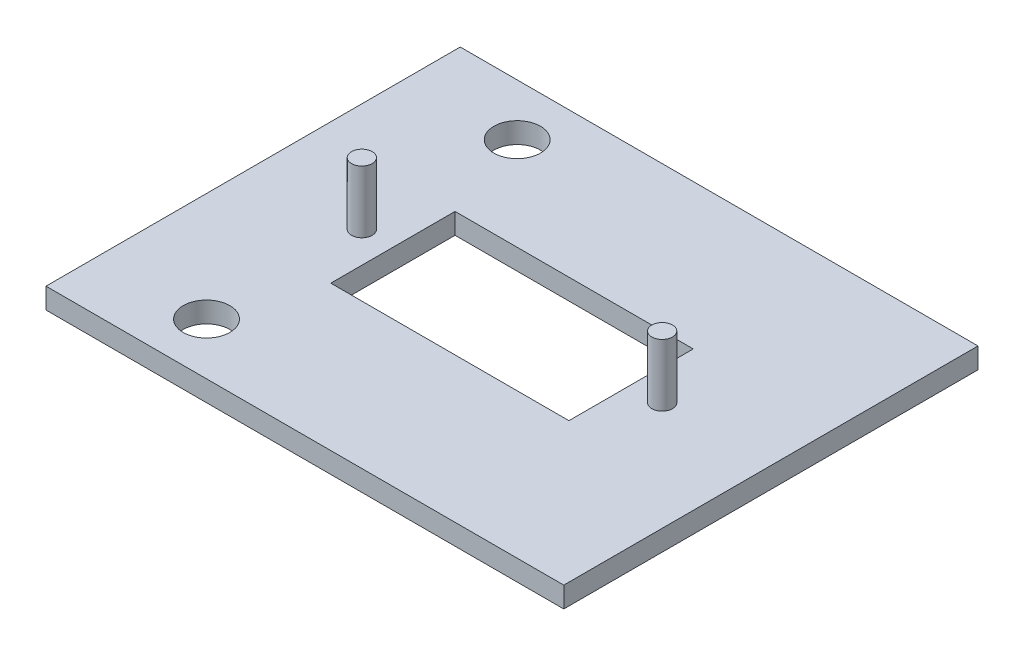
ISO-10303-21;
HEADER;
FILE_DESCRIPTION(('STEP AP214'),'2;1');
FILE_NAME('part.step','',(''),(''),'','','');
FILE_SCHEMA(('AUTOMOTIVE_DESIGN { 1 0 10303 214 1 1 1 1 }'));
ENDSEC;
DATA;
#1=APPLICATION_CONTEXT('core data for automotive mechanical design processes');
#2=APPLICATION_PROTOCOL_DEFINITION('international standard','automotive_design',2000,#1);
#3=PRODUCT_CONTEXT('',#1,'mechanical');
#4=PRODUCT('Part','Part','',(#3));
#5=PRODUCT_RELATED_PRODUCT_CATEGORY('part','',(#4));
#6=PRODUCT_DEFINITION_FORMATION('','',#4);
#7=PRODUCT_DEFINITION_CONTEXT('part definition',#1,'design');
#8=PRODUCT_DEFINITION('design','',#6,#7);
#9=PRODUCT_DEFINITION_SHAPE('','',#8);
#10=(LENGTH_UNIT() NAMED_UNIT(*) SI_UNIT(.MILLI.,.METRE.));
#11=(NAMED_UNIT(*) PLANE_ANGLE_UNIT() SI_UNIT($,.RADIAN.));
#12=(NAMED_UNIT(*) SI_UNIT($,.STERADIAN.) SOLID_ANGLE_UNIT());
#13=UNCERTAINTY_MEASURE_WITH_UNIT(LENGTH_MEASURE(1.E-05),#10,'distance_accuracy_value','');
#14=(GEOMETRIC_REPRESENTATION_CONTEXT(3) GLOBAL_UNCERTAINTY_ASSIGNED_CONTEXT((#13)) GLOBAL_UNIT_ASSIGNED_CONTEXT((#10,
#11,#12)) REPRESENTATION_CONTEXT('',''));
#15=CARTESIAN_POINT('',(0.,0.,0.));
#16=DIRECTION('',(0.,0.,1.));
#17=DIRECTION('',(1.,0.,0.));
#18=AXIS2_PLACEMENT_3D('',#15,#16,#17);
#19=CARTESIAN_POINT('',(-25.,2.,-20.));
#20=DIRECTION('',(0.,0.,-1.));
#21=DIRECTION('',(-1.,0.,0.));
#22=AXIS2_PLACEMENT_3D('',#19,#20,#21);
#23=PLANE('',#22);
#24=DIRECTION('',(1.,0.,0.));
#25=VECTOR('',#24,1.);
#26=CARTESIAN_POINT('',(-25.,0.,-20.));
#27=LINE('',#26,#25);
#28=CARTESIAN_POINT('',(-25.,0.,-20.));
#29=VERTEX_POINT('',#28);
#30=CARTESIAN_POINT('',(25.,0.,-20.));
#31=VERTEX_POINT('',#30);
#32=EDGE_CURVE('E83',#29,#31,#27,.T.);
#33=ORIENTED_EDGE('',*,*,#32,.F.);
#34=DIRECTION('',(0.,-1.,0.));
#35=VECTOR('',#34,1.);
#36=CARTESIAN_POINT('',(-25.,2.,-20.));
#37=LINE('',#36,#35);
#38=CARTESIAN_POINT('',(-25.,2.,-20.));
#39=VERTEX_POINT('',#38);
#40=EDGE_CURVE('E21',#39,#29,#37,.T.);
#41=ORIENTED_EDGE('',*,*,#40,.F.);
#42=DIRECTION('',(1.,0.,0.));
#43=VECTOR('',#42,1.);
#44=CARTESIAN_POINT('',(-25.,2.,-20.));
#45=LINE('',#44,#43);
#46=CARTESIAN_POINT('',(25.,2.,-20.));
#47=VERTEX_POINT('',#46);
#48=EDGE_CURVE('E81',#39,#47,#45,.T.);
#49=ORIENTED_EDGE('',*,*,#48,.T.);
#50=DIRECTION('',(0.,-1.,0.));
#51=VECTOR('',#50,1.);
#52=CARTESIAN_POINT('',(25.,2.,-20.));
#53=LINE('',#52,#51);
#54=EDGE_CURVE('E11',#47,#31,#53,.T.);
#55=ORIENTED_EDGE('',*,*,#54,.T.);
#56=EDGE_LOOP('',(#33,#41,#49,#55));
#57=FACE_BOUND('',#56,.T.);
#58=ADVANCED_FACE('F18',(#57),#23,.T.);
#59=CARTESIAN_POINT('',(25.,2.,-25.));
#60=DIRECTION('',(1.,0.,0.));
#61=DIRECTION('',(0.,0.,-1.));
#62=AXIS2_PLACEMENT_3D('',#59,#60,#61);
#63=PLANE('',#62);
#64=DIRECTION('',(0.,0.,1.));
#65=VECTOR('',#64,1.);
#66=CARTESIAN_POINT('',(25.,0.,-25.));
#67=LINE('',#66,#65);
#68=CARTESIAN_POINT('',(25.,0.,20.));
#69=VERTEX_POINT('',#68);
#70=EDGE_CURVE('E108',#31,#69,#67,.T.);
#71=ORIENTED_EDGE('',*,*,#70,.F.);
#72=ORIENTED_EDGE('',*,*,#54,.F.);
#73=DIRECTION('',(0.,0.,1.));
#74=VECTOR('',#73,1.);
#75=CARTESIAN_POINT('',(25.,2.,-25.));
#76=LINE('',#75,#74);
#77=CARTESIAN_POINT('',(25.,2.,20.));
#78=VERTEX_POINT('',#77);
#79=EDGE_CURVE('E99',#47,#78,#76,.T.);
#80=ORIENTED_EDGE('',*,*,#79,.T.);
#81=DIRECTION('',(0.,-1.,0.));
#82=VECTOR('',#81,1.);
#83=CARTESIAN_POINT('',(25.,2.,20.));
#84=LINE('',#83,#82);
#85=EDGE_CURVE('E27',#78,#69,#84,.T.);
#86=ORIENTED_EDGE('',*,*,#85,.T.);
#87=EDGE_LOOP('',(#71,#72,#80,#86));
#88=FACE_BOUND('',#87,.T.);
#89=ADVANCED_FACE('F199',(#88),#63,.T.);
#90=CARTESIAN_POINT('',(25.,2.,20.));
#91=DIRECTION('',(0.,0.,1.));
#92=DIRECTION('',(1.,0.,0.));
#93=AXIS2_PLACEMENT_3D('',#90,#91,#92);
#94=PLANE('',#93);
#95=DIRECTION('',(-1.,0.,0.));
#96=VECTOR('',#95,1.);
#97=CARTESIAN_POINT('',(25.,0.,20.));
#98=LINE('',#97,#96);
#99=CARTESIAN_POINT('',(-25.,0.,20.));
#100=VERTEX_POINT('',#99);
#101=EDGE_CURVE('E103',#69,#100,#98,.T.);
#102=ORIENTED_EDGE('',*,*,#101,.F.);
#103=ORIENTED_EDGE('',*,*,#85,.F.);
#104=DIRECTION('',(-1.,0.,0.));
#105=VECTOR('',#104,1.);
#106=CARTESIAN_POINT('',(25.,2.,20.));
#107=LINE('',#106,#105);
#108=CARTESIAN_POINT('',(-25.,2.,20.));
#109=VERTEX_POINT('',#108);
#110=EDGE_CURVE('E94',#78,#109,#107,.T.);
#111=ORIENTED_EDGE('',*,*,#110,.T.);
#112=DIRECTION('',(0.,-1.,0.));
#113=VECTOR('',#112,1.);
#114=CARTESIAN_POINT('',(-25.,2.,20.));
#115=LINE('',#114,#113);
#116=EDGE_CURVE('E87',#109,#100,#115,.T.);
#117=ORIENTED_EDGE('',*,*,#116,.T.);
#118=EDGE_LOOP('',(#102,#103,#111,#117));
#119=FACE_BOUND('',#118,.T.);
#120=ADVANCED_FACE('F203',(#119),#94,.T.);
#121=CARTESIAN_POINT('',(-25.,2.,25.));
#122=DIRECTION('',(-1.,0.,0.));
#123=DIRECTION('',(0.,0.,1.));
#124=AXIS2_PLACEMENT_3D('',#121,#122,#123);
#125=PLANE('',#124);
#126=DIRECTION('',(0.,0.,-1.));
#127=VECTOR('',#126,1.);
#128=CARTESIAN_POINT('',(-25.,0.,25.));
#129=LINE('',#128,#127);
#130=EDGE_CURVE('E100',#100,#29,#129,.T.);
#131=ORIENTED_EDGE('',*,*,#130,.F.);
#132=ORIENTED_EDGE('',*,*,#116,.F.);
#133=DIRECTION('',(0.,0.,-1.));
#134=VECTOR('',#133,1.);
#135=CARTESIAN_POINT('',(-25.,2.,25.));
#136=LINE('',#135,#134);
#137=EDGE_CURVE('E88',#109,#39,#136,.T.);
#138=ORIENTED_EDGE('',*,*,#137,.T.);
#139=ORIENTED_EDGE('',*,*,#40,.T.);
#140=EDGE_LOOP('',(#131,#132,#138,#139));
#141=FACE_BOUND('',#140,.T.);
#142=ADVANCED_FACE('F90',(#141),#125,.T.);
#143=CARTESIAN_POINT('',(0.,2.,0.));
#144=DIRECTION('',(0.,-1.,0.));
#145=DIRECTION('',(0.,0.,-1.));
#146=AXIS2_PLACEMENT_3D('',#143,#144,#145);
#147=PLANE('',#146);
#148=CARTESIAN_POINT('',(-14.5,2.,-15.));
#149=DIRECTION('',(0.,-1.,0.));
#150=DIRECTION('',(-1.,0.,0.));
#151=AXIS2_PLACEMENT_3D('',#148,#149,#150);
#152=CIRCLE('',#151,2.25);
#153=CARTESIAN_POINT('',(-16.75,2.,-15.));
#154=VERTEX_POINT('',#153);
#155=EDGE_CURVE('E120',#154,#154,#152,.T.);
#156=ORIENTED_EDGE('',*,*,#155,.T.);
#157=EDGE_LOOP('',(#156));
#158=FACE_BOUND('',#157,.T.);
#159=CARTESIAN_POINT('',(-14.5,2.,15.));
#160=DIRECTION('',(0.,-1.,0.));
#161=DIRECTION('',(-1.,0.,0.));
#162=AXIS2_PLACEMENT_3D('',#159,#160,#161);
#163=CIRCLE('',#162,2.25);
#164=CARTESIAN_POINT('',(-16.75,2.,15.));
#165=VERTEX_POINT('',#164);
#166=EDGE_CURVE('E119',#165,#165,#163,.T.);
#167=ORIENTED_EDGE('',*,*,#166,.T.);
#168=EDGE_LOOP('',(#167));
#169=FACE_BOUND('',#168,.T.);
#170=CARTESIAN_POINT('',(-14.5,2.,0.));
#171=DIRECTION('',(0.,-1.,0.));
#172=DIRECTION('',(0.,0.,-1.));
#173=AXIS2_PLACEMENT_3D('',#170,#171,#172);
#174=CIRCLE('',#173,1.);
#175=CARTESIAN_POINT('',(-14.5,2.,-0.999999999999998));
#176=VERTEX_POINT('',#175);
#177=EDGE_CURVE('E124',#176,#176,#174,.T.);
#178=ORIENTED_EDGE('',*,*,#177,.T.);
#179=EDGE_LOOP('',(#178));
#180=FACE_BOUND('',#179,.T.);
#181=CARTESIAN_POINT('',(14.5,2.,0.));
#182=DIRECTION('',(0.,-1.,0.));
#183=DIRECTION('',(0.,0.,-1.));
#184=AXIS2_PLACEMENT_3D('',#181,#182,#183);
#185=CIRCLE('',#184,1.);
#186=CARTESIAN_POINT('',(14.5,2.,-1.));
#187=VERTEX_POINT('',#186);
#188=EDGE_CURVE('E125',#187,#187,#185,.T.);
#189=ORIENTED_EDGE('',*,*,#188,.T.);
#190=EDGE_LOOP('',(#189));
#191=FACE_BOUND('',#190,.T.);
#192=DIRECTION('',(0.,0.,-1.));
#193=VECTOR('',#192,1.);
#194=CARTESIAN_POINT('',(-11.5,2.,0.));
#195=LINE('',#194,#193);
#196=CARTESIAN_POINT('',(-11.5,2.,6.));
#197=VERTEX_POINT('',#196);
#198=CARTESIAN_POINT('',(-11.5,2.,-6.));
#199=VERTEX_POINT('',#198);
#200=EDGE_CURVE('E153',#197,#199,#195,.T.);
#201=ORIENTED_EDGE('',*,*,#200,.T.);
#202=DIRECTION('',(1.,0.,0.));
#203=VECTOR('',#202,1.);
#204=CARTESIAN_POINT('',(0.,2.,-6.));
#205=LINE('',#204,#203);
#206=CARTESIAN_POINT('',(11.5,2.,-6.));
#207=VERTEX_POINT('',#206);
#208=EDGE_CURVE('E109',#199,#207,#205,.T.);
#209=ORIENTED_EDGE('',*,*,#208,.T.);
#210=DIRECTION('',(0.,0.,1.));
#211=VECTOR('',#210,1.);
#212=CARTESIAN_POINT('',(11.5,2.,0.));
#213=LINE('',#212,#211);
#214=CARTESIAN_POINT('',(11.5,2.,6.));
#215=VERTEX_POINT('',#214);
#216=EDGE_CURVE('E148',#207,#215,#213,.T.);
#217=ORIENTED_EDGE('',*,*,#216,.T.);
#218=DIRECTION('',(-1.,0.,0.));
#219=VECTOR('',#218,1.);
#220=CARTESIAN_POINT('',(0.,2.,6.));
#221=LINE('',#220,#219);
#222=EDGE_CURVE('E151',#215,#197,#221,.T.);
#223=ORIENTED_EDGE('',*,*,#222,.T.);
#224=EDGE_LOOP('',(#201,#209,#217,#223));
#225=FACE_BOUND('',#224,.T.);
#226=ORIENTED_EDGE('',*,*,#48,.F.);
#227=ORIENTED_EDGE('',*,*,#137,.F.);
#228=ORIENTED_EDGE('',*,*,#110,.F.);
#229=ORIENTED_EDGE('',*,*,#79,.F.);
#230=EDGE_LOOP('',(#226,#227,#228,#229));
#231=FACE_BOUND('',#230,.T.);
#232=ADVANCED_FACE('F97',(#158,#169,#180,#191,#225,#231),#147,.F.);
#233=CARTESIAN_POINT('',(0.,0.,0.));
#234=DIRECTION('',(0.,-1.,0.));
#235=DIRECTION('',(0.,0.,-1.));
#236=AXIS2_PLACEMENT_3D('',#233,#234,#235);
#237=PLANE('',#236);
#238=CARTESIAN_POINT('',(-14.5,0.,-15.));
#239=DIRECTION('',(0.,-1.,0.));
#240=DIRECTION('',(0.,0.,-1.));
#241=AXIS2_PLACEMENT_3D('',#238,#239,#240);
#242=CIRCLE('',#241,2.25);
#243=CARTESIAN_POINT('',(-14.5,0.,-17.25));
#244=VERTEX_POINT('',#243);
#245=EDGE_CURVE('E116',#244,#244,#242,.F.);
#246=ORIENTED_EDGE('',*,*,#245,.T.);
#247=EDGE_LOOP('',(#246));
#248=FACE_BOUND('',#247,.T.);
#249=CARTESIAN_POINT('',(-14.5,0.,15.));
#250=DIRECTION('',(0.,-1.,0.));
#251=DIRECTION('',(0.,0.,-1.));
#252=AXIS2_PLACEMENT_3D('',#249,#250,#251);
#253=CIRCLE('',#252,2.25);
#254=CARTESIAN_POINT('',(-14.5,0.,12.75));
#255=VERTEX_POINT('',#254);
#256=EDGE_CURVE('E121',#255,#255,#253,.F.);
#257=ORIENTED_EDGE('',*,*,#256,.T.);
#258=EDGE_LOOP('',(#257));
#259=FACE_BOUND('',#258,.T.);
#260=DIRECTION('',(1.,0.,0.));
#261=VECTOR('',#260,1.);
#262=CARTESIAN_POINT('',(-11.5,0.,-6.));
#263=LINE('',#262,#261);
#264=CARTESIAN_POINT('',(-11.5,0.,-6.));
#265=VERTEX_POINT('',#264);
#266=CARTESIAN_POINT('',(11.5,0.,-6.));
#267=VERTEX_POINT('',#266);
#268=EDGE_CURVE('E133',#265,#267,#263,.T.);
#269=ORIENTED_EDGE('',*,*,#268,.F.);
#270=DIRECTION('',(0.,0.,-1.));
#271=VECTOR('',#270,1.);
#272=CARTESIAN_POINT('',(-11.5,0.,6.));
#273=LINE('',#272,#271);
#274=CARTESIAN_POINT('',(-11.5,0.,6.));
#275=VERTEX_POINT('',#274);
#276=EDGE_CURVE('E154',#275,#265,#273,.T.);
#277=ORIENTED_EDGE('',*,*,#276,.F.);
#278=DIRECTION('',(-1.,0.,0.));
#279=VECTOR('',#278,1.);
#280=CARTESIAN_POINT('',(11.5,0.,6.));
#281=LINE('',#280,#279);
#282=CARTESIAN_POINT('',(11.5,0.,6.));
#283=VERTEX_POINT('',#282);
#284=EDGE_CURVE('E143',#283,#275,#281,.T.);
#285=ORIENTED_EDGE('',*,*,#284,.F.);
#286=DIRECTION('',(0.,0.,1.));
#287=VECTOR('',#286,1.);
#288=CARTESIAN_POINT('',(11.5,0.,-6.));
#289=LINE('',#288,#287);
#290=EDGE_CURVE('E139',#267,#283,#289,.T.);
#291=ORIENTED_EDGE('',*,*,#290,.F.);
#292=EDGE_LOOP('',(#269,#277,#285,#291));
#293=FACE_BOUND('',#292,.T.);
#294=ORIENTED_EDGE('',*,*,#32,.T.);
#295=ORIENTED_EDGE('',*,*,#70,.T.);
#296=ORIENTED_EDGE('',*,*,#101,.T.);
#297=ORIENTED_EDGE('',*,*,#130,.T.);
#298=EDGE_LOOP('',(#294,#295,#296,#297));
#299=FACE_BOUND('',#298,.T.);
#300=ADVANCED_FACE('F243',(#248,#259,#293,#299),#237,.T.);
#301=CARTESIAN_POINT('',(-11.5,52.8700853523038,-6.));
#302=DIRECTION('',(0.,0.,-1.));
#303=DIRECTION('',(-1.,0.,0.));
#304=AXIS2_PLACEMENT_3D('',#301,#302,#303);
#305=PLANE('',#304);
#306=DIRECTION('',(0.,-1.,0.));
#307=VECTOR('',#306,1.);
#308=CARTESIAN_POINT('',(-11.5,52.8700853523038,-6.));
#309=LINE('',#308,#307);
#310=EDGE_CURVE('E36',#199,#265,#309,.T.);
#311=ORIENTED_EDGE('',*,*,#310,.T.);
#312=ORIENTED_EDGE('',*,*,#268,.T.);
#313=DIRECTION('',(0.,-1.,0.));
#314=VECTOR('',#313,1.);
#315=CARTESIAN_POINT('',(11.5,52.8700853523038,-6.));
#316=LINE('',#315,#314);
#317=EDGE_CURVE('E146',#207,#267,#316,.T.);
#318=ORIENTED_EDGE('',*,*,#317,.F.);
#319=ORIENTED_EDGE('',*,*,#208,.F.);
#320=EDGE_LOOP('',(#311,#312,#318,#319));
#321=FACE_BOUND('',#320,.T.);
#322=ADVANCED_FACE('F222',(#321),#305,.F.);
#323=CARTESIAN_POINT('',(11.5,52.8700853523038,-6.));
#324=DIRECTION('',(1.,0.,0.));
#325=DIRECTION('',(0.,0.,-1.));
#326=AXIS2_PLACEMENT_3D('',#323,#324,#325);
#327=PLANE('',#326);
#328=ORIENTED_EDGE('',*,*,#317,.T.);
#329=ORIENTED_EDGE('',*,*,#290,.T.);
#330=DIRECTION('',(0.,-1.,0.));
#331=VECTOR('',#330,1.);
#332=CARTESIAN_POINT('',(11.5,52.8700853523038,6.));
#333=LINE('',#332,#331);
#334=EDGE_CURVE('E144',#215,#283,#333,.T.);
#335=ORIENTED_EDGE('',*,*,#334,.F.);
#336=ORIENTED_EDGE('',*,*,#216,.F.);
#337=EDGE_LOOP('',(#328,#329,#335,#336));
#338=FACE_BOUND('',#337,.T.);
#339=ADVANCED_FACE('F219',(#338),#327,.F.);
#340=CARTESIAN_POINT('',(11.5,52.8700853523038,6.));
#341=DIRECTION('',(0.,0.,1.));
#342=DIRECTION('',(1.,0.,0.));
#343=AXIS2_PLACEMENT_3D('',#340,#341,#342);
#344=PLANE('',#343);
#345=ORIENTED_EDGE('',*,*,#334,.T.);
#346=ORIENTED_EDGE('',*,*,#284,.T.);
#347=DIRECTION('',(0.,-1.,0.));
#348=VECTOR('',#347,1.);
#349=CARTESIAN_POINT('',(-11.5,52.8700853523038,6.));
#350=LINE('',#349,#348);
#351=EDGE_CURVE('E147',#197,#275,#350,.T.);
#352=ORIENTED_EDGE('',*,*,#351,.F.);
#353=ORIENTED_EDGE('',*,*,#222,.F.);
#354=EDGE_LOOP('',(#345,#346,#352,#353));
#355=FACE_BOUND('',#354,.T.);
#356=ADVANCED_FACE('F218',(#355),#344,.F.);
#357=CARTESIAN_POINT('',(-11.5,52.8700853523038,6.));
#358=DIRECTION('',(-1.,0.,0.));
#359=DIRECTION('',(0.,0.,1.));
#360=AXIS2_PLACEMENT_3D('',#357,#358,#359);
#361=PLANE('',#360);
#362=ORIENTED_EDGE('',*,*,#351,.T.);
#363=ORIENTED_EDGE('',*,*,#276,.T.);
#364=ORIENTED_EDGE('',*,*,#310,.F.);
#365=ORIENTED_EDGE('',*,*,#200,.F.);
#366=EDGE_LOOP('',(#362,#363,#364,#365));
#367=FACE_BOUND('',#366,.T.);
#368=ADVANCED_FACE('F214',(#367),#361,.F.);
#369=CARTESIAN_POINT('',(14.5,8.,0.));
#370=DIRECTION('',(0.,-1.,0.));
#371=DIRECTION('',(0.,0.,-1.));
#372=AXIS2_PLACEMENT_3D('',#369,#370,#371);
#373=CYLINDRICAL_SURFACE('',#372,1.);
#374=CARTESIAN_POINT('',(14.5,8.,0.));
#375=DIRECTION('',(0.,-1.,0.));
#376=DIRECTION('',(0.,0.,-1.));
#377=AXIS2_PLACEMENT_3D('',#374,#375,#376);
#378=CIRCLE('',#377,1.);
#379=CARTESIAN_POINT('',(14.5,8.,-1.));
#380=VERTEX_POINT('',#379);
#381=EDGE_CURVE('E129',#380,#380,#378,.T.);
#382=ORIENTED_EDGE('',*,*,#381,.T.);
#383=EDGE_LOOP('',(#382));
#384=FACE_BOUND('',#383,.T.);
#385=ORIENTED_EDGE('',*,*,#188,.F.);
#386=EDGE_LOOP('',(#385));
#387=FACE_BOUND('',#386,.T.);
#388=ADVANCED_FACE('F217',(#384,#387),#373,.T.);
#389=CARTESIAN_POINT('',(14.5,8.,0.));
#390=DIRECTION('',(0.,-1.,0.));
#391=DIRECTION('',(0.,0.,-1.));
#392=AXIS2_PLACEMENT_3D('',#389,#390,#391);
#393=PLANE('',#392);
#394=ORIENTED_EDGE('',*,*,#381,.F.);
#395=EDGE_LOOP('',(#394));
#396=FACE_BOUND('',#395,.T.);
#397=ADVANCED_FACE('F227',(#396),#393,.F.);
#398=CARTESIAN_POINT('',(-14.5,8.,0.));
#399=DIRECTION('',(0.,-1.,0.));
#400=DIRECTION('',(0.,0.,-1.));
#401=AXIS2_PLACEMENT_3D('',#398,#399,#400);
#402=CYLINDRICAL_SURFACE('',#401,1.);
#403=CARTESIAN_POINT('',(-14.5,8.,0.));
#404=DIRECTION('',(0.,-1.,0.));
#405=DIRECTION('',(0.,0.,-1.));
#406=AXIS2_PLACEMENT_3D('',#403,#404,#405);
#407=CIRCLE('',#406,1.);
#408=CARTESIAN_POINT('',(-14.5,8.,-0.999999999999998));
#409=VERTEX_POINT('',#408);
#410=EDGE_CURVE('E130',#409,#409,#407,.T.);
#411=ORIENTED_EDGE('',*,*,#410,.T.);
#412=EDGE_LOOP('',(#411));
#413=FACE_BOUND('',#412,.T.);
#414=ORIENTED_EDGE('',*,*,#177,.F.);
#415=EDGE_LOOP('',(#414));
#416=FACE_BOUND('',#415,.T.);
#417=ADVANCED_FACE('F224',(#413,#416),#402,.T.);
#418=CARTESIAN_POINT('',(-14.5,8.,0.));
#419=DIRECTION('',(0.,-1.,0.));
#420=DIRECTION('',(0.,0.,-1.));
#421=AXIS2_PLACEMENT_3D('',#418,#419,#420);
#422=PLANE('',#421);
#423=ORIENTED_EDGE('',*,*,#410,.F.);
#424=EDGE_LOOP('',(#423));
#425=FACE_BOUND('',#424,.T.);
#426=ADVANCED_FACE('F194',(#425),#422,.F.);
#427=CARTESIAN_POINT('',(-14.5,-29.7748639411622,15.));
#428=DIRECTION('',(0.,1.,0.));
#429=DIRECTION('',(0.,0.,1.));
#430=AXIS2_PLACEMENT_3D('',#427,#428,#429);
#431=CYLINDRICAL_SURFACE('',#430,2.25);
#432=ORIENTED_EDGE('',*,*,#256,.F.);
#433=EDGE_LOOP('',(#432));
#434=FACE_BOUND('',#433,.T.);
#435=ORIENTED_EDGE('',*,*,#166,.F.);
#436=EDGE_LOOP('',(#435));
#437=FACE_BOUND('',#436,.T.);
#438=ADVANCED_FACE('F187',(#434,#437),#431,.F.);
#439=CARTESIAN_POINT('',(-14.5,-29.7748639411622,-15.));
#440=DIRECTION('',(0.,1.,0.));
#441=DIRECTION('',(0.,0.,1.));
#442=AXIS2_PLACEMENT_3D('',#439,#440,#441);
#443=CYLINDRICAL_SURFACE('',#442,2.25);
#444=ORIENTED_EDGE('',*,*,#245,.F.);
#445=EDGE_LOOP('',(#444));
#446=FACE_BOUND('',#445,.T.);
#447=ORIENTED_EDGE('',*,*,#155,.F.);
#448=EDGE_LOOP('',(#447));
#449=FACE_BOUND('',#448,.T.);
#450=ADVANCED_FACE('F185',(#446,#449),#443,.F.);
#451=CLOSED_SHELL('',(#58,#89,#120,#142,#232,#300,#322,#339,#356,#368,#388,#397,#417,#426,#438,#450));
#452=MANIFOLD_SOLID_BREP('B1',#451);
#453=ADVANCED_BREP_SHAPE_REPRESENTATION('',(#18,#452),#14);
#454=SHAPE_DEFINITION_REPRESENTATION(#9,#453);
ENDSEC;
END-ISO-10303-21;
